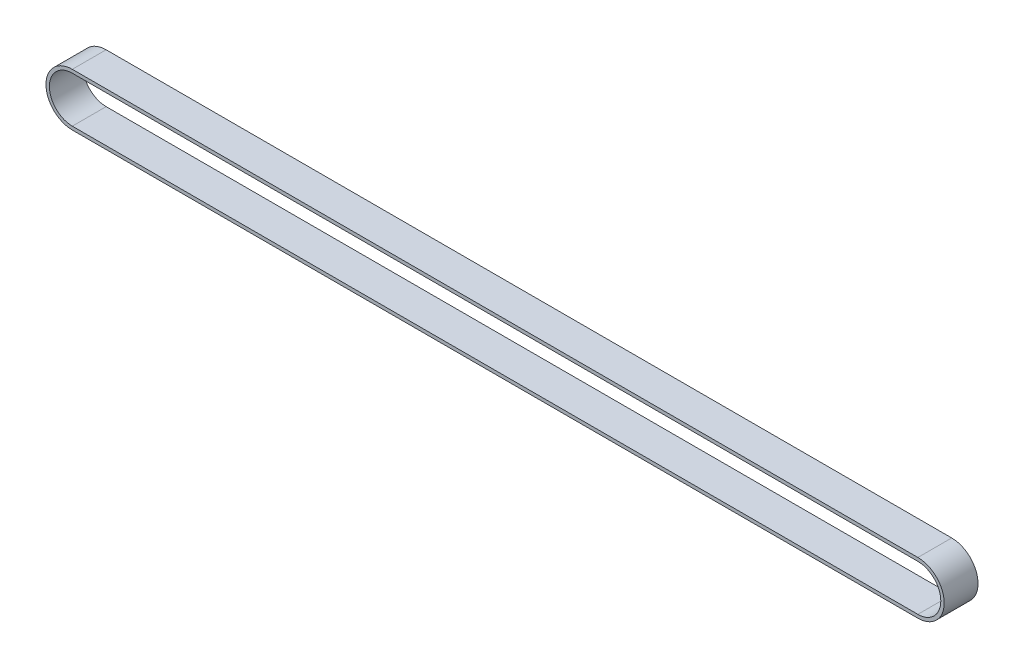
ISO-10303-21;
HEADER;
FILE_DESCRIPTION(('STEP AP214'),'2;1');
FILE_NAME('part.step','',(''),(''),'','','');
FILE_SCHEMA(('AUTOMOTIVE_DESIGN { 1 0 10303 214 1 1 1 1 }'));
ENDSEC;
DATA;
#1=APPLICATION_CONTEXT('core data for automotive mechanical design processes');
#2=APPLICATION_PROTOCOL_DEFINITION('international standard','automotive_design',2000,#1);
#3=PRODUCT_CONTEXT('',#1,'mechanical');
#4=PRODUCT('Part','Part','',(#3));
#5=PRODUCT_RELATED_PRODUCT_CATEGORY('part','',(#4));
#6=PRODUCT_DEFINITION_FORMATION('','',#4);
#7=PRODUCT_DEFINITION_CONTEXT('part definition',#1,'design');
#8=PRODUCT_DEFINITION('design','',#6,#7);
#9=PRODUCT_DEFINITION_SHAPE('','',#8);
#10=(LENGTH_UNIT() NAMED_UNIT(*) SI_UNIT(.MILLI.,.METRE.));
#11=(NAMED_UNIT(*) PLANE_ANGLE_UNIT() SI_UNIT($,.RADIAN.));
#12=(NAMED_UNIT(*) SI_UNIT($,.STERADIAN.) SOLID_ANGLE_UNIT());
#13=UNCERTAINTY_MEASURE_WITH_UNIT(LENGTH_MEASURE(1.E-05),#10,'distance_accuracy_value','');
#14=(GEOMETRIC_REPRESENTATION_CONTEXT(3) GLOBAL_UNCERTAINTY_ASSIGNED_CONTEXT((#13)) GLOBAL_UNIT_ASSIGNED_CONTEXT((#10,
#11,#12)) REPRESENTATION_CONTEXT('',''));
#15=CARTESIAN_POINT('',(0.,0.,0.));
#16=DIRECTION('',(0.,0.,1.));
#17=DIRECTION('',(1.,0.,0.));
#18=AXIS2_PLACEMENT_3D('',#15,#16,#17);
#19=CARTESIAN_POINT('',(125.,0.,5.));
#20=DIRECTION('',(0.,0.,1.));
#21=DIRECTION('',(1.,0.,0.));
#22=AXIS2_PLACEMENT_3D('',#19,#20,#21);
#23=PLANE('',#22);
#24=CARTESIAN_POINT('',(125.,0.,5.));
#25=DIRECTION('',(0.,0.,1.));
#26=DIRECTION('',(1.,0.,0.));
#27=AXIS2_PLACEMENT_3D('',#24,#25,#26);
#28=CIRCLE('',#27,7.78);
#29=CARTESIAN_POINT('',(125.,-7.78000000000003,5.));
#30=VERTEX_POINT('',#29);
#31=CARTESIAN_POINT('',(125.,7.77999999999997,5.));
#32=VERTEX_POINT('',#31);
#33=EDGE_CURVE('E134',#30,#32,#28,.T.);
#34=ORIENTED_EDGE('',*,*,#33,.T.);
#35=DIRECTION('',(-1.,0.,0.));
#36=VECTOR('',#35,1.);
#37=CARTESIAN_POINT('',(125.,7.77999999999997,5.));
#38=LINE('',#37,#36);
#39=CARTESIAN_POINT('',(-125.,7.78,5.));
#40=VERTEX_POINT('',#39);
#41=EDGE_CURVE('E137',#32,#40,#38,.T.);
#42=ORIENTED_EDGE('',*,*,#41,.T.);
#43=CARTESIAN_POINT('',(-125.,0.,5.));
#44=DIRECTION('',(0.,0.,1.));
#45=DIRECTION('',(1.,0.,0.));
#46=AXIS2_PLACEMENT_3D('',#43,#44,#45);
#47=CIRCLE('',#46,7.78);
#48=CARTESIAN_POINT('',(-125.,-7.78,5.));
#49=VERTEX_POINT('',#48);
#50=EDGE_CURVE('E140',#40,#49,#47,.T.);
#51=ORIENTED_EDGE('',*,*,#50,.T.);
#52=DIRECTION('',(1.,0.,0.));
#53=VECTOR('',#52,1.);
#54=CARTESIAN_POINT('',(125.,-7.78000000000003,5.));
#55=LINE('',#54,#53);
#56=EDGE_CURVE('E142',#49,#30,#55,.T.);
#57=ORIENTED_EDGE('',*,*,#56,.T.);
#58=EDGE_LOOP('',(#34,#42,#51,#57));
#59=FACE_BOUND('',#58,.T.);
#60=DIRECTION('',(-1.,0.,0.));
#61=VECTOR('',#60,1.);
#62=CARTESIAN_POINT('',(125.,6.78000000000003,5.));
#63=LINE('',#62,#61);
#64=CARTESIAN_POINT('',(125.,6.78000000000003,5.));
#65=VERTEX_POINT('',#64);
#66=CARTESIAN_POINT('',(-125.,6.78,5.));
#67=VERTEX_POINT('',#66);
#68=EDGE_CURVE('E106',#65,#67,#63,.T.);
#69=ORIENTED_EDGE('',*,*,#68,.F.);
#70=CARTESIAN_POINT('',(125.,0.,5.));
#71=DIRECTION('',(0.,0.,1.));
#72=DIRECTION('',(1.,0.,0.));
#73=AXIS2_PLACEMENT_3D('',#70,#71,#72);
#74=CIRCLE('',#73,6.78);
#75=CARTESIAN_POINT('',(125.,-6.77999999999997,5.));
#76=VERTEX_POINT('',#75);
#77=EDGE_CURVE('E98',#76,#65,#74,.T.);
#78=ORIENTED_EDGE('',*,*,#77,.F.);
#79=DIRECTION('',(1.,0.,0.));
#80=VECTOR('',#79,1.);
#81=CARTESIAN_POINT('',(125.,-6.77999999999997,5.));
#82=LINE('',#81,#80);
#83=CARTESIAN_POINT('',(-125.,-6.78,5.));
#84=VERTEX_POINT('',#83);
#85=EDGE_CURVE('E120',#84,#76,#82,.T.);
#86=ORIENTED_EDGE('',*,*,#85,.F.);
#87=CARTESIAN_POINT('',(-125.,0.,5.));
#88=DIRECTION('',(0.,0.,1.));
#89=DIRECTION('',(1.,0.,0.));
#90=AXIS2_PLACEMENT_3D('',#87,#88,#89);
#91=CIRCLE('',#90,6.78);
#92=EDGE_CURVE('E118',#67,#84,#91,.T.);
#93=ORIENTED_EDGE('',*,*,#92,.F.);
#94=EDGE_LOOP('',(#69,#78,#86,#93));
#95=FACE_BOUND('',#94,.T.);
#96=ADVANCED_FACE('F33',(#59,#95),#23,.T.);
#97=CARTESIAN_POINT('',(125.,0.,-5.));
#98=DIRECTION('',(0.,0.,1.));
#99=DIRECTION('',(1.,0.,0.));
#100=AXIS2_PLACEMENT_3D('',#97,#98,#99);
#101=PLANE('',#100);
#102=CARTESIAN_POINT('',(125.,0.,-5.));
#103=DIRECTION('',(0.,0.,1.));
#104=DIRECTION('',(1.,0.,0.));
#105=AXIS2_PLACEMENT_3D('',#102,#103,#104);
#106=CIRCLE('',#105,7.78);
#107=CARTESIAN_POINT('',(125.,-7.78000000000003,-5.));
#108=VERTEX_POINT('',#107);
#109=CARTESIAN_POINT('',(125.,7.77999999999997,-5.));
#110=VERTEX_POINT('',#109);
#111=EDGE_CURVE('E114',#108,#110,#106,.T.);
#112=ORIENTED_EDGE('',*,*,#111,.F.);
#113=DIRECTION('',(1.,0.,0.));
#114=VECTOR('',#113,1.);
#115=CARTESIAN_POINT('',(125.,-7.78000000000003,-5.));
#116=LINE('',#115,#114);
#117=CARTESIAN_POINT('',(-125.,-7.78,-5.));
#118=VERTEX_POINT('',#117);
#119=EDGE_CURVE('E138',#118,#108,#116,.T.);
#120=ORIENTED_EDGE('',*,*,#119,.F.);
#121=CARTESIAN_POINT('',(-125.,0.,-5.));
#122=DIRECTION('',(0.,0.,1.));
#123=DIRECTION('',(1.,0.,0.));
#124=AXIS2_PLACEMENT_3D('',#121,#122,#123);
#125=CIRCLE('',#124,7.78);
#126=CARTESIAN_POINT('',(-125.,7.78,-5.));
#127=VERTEX_POINT('',#126);
#128=EDGE_CURVE('E149',#127,#118,#125,.T.);
#129=ORIENTED_EDGE('',*,*,#128,.F.);
#130=DIRECTION('',(-1.,0.,0.));
#131=VECTOR('',#130,1.);
#132=CARTESIAN_POINT('',(125.,7.77999999999997,-5.));
#133=LINE('',#132,#131);
#134=EDGE_CURVE('E147',#110,#127,#133,.T.);
#135=ORIENTED_EDGE('',*,*,#134,.F.);
#136=EDGE_LOOP('',(#112,#120,#129,#135));
#137=FACE_BOUND('',#136,.T.);
#138=CARTESIAN_POINT('',(125.,0.,-5.));
#139=DIRECTION('',(0.,0.,1.));
#140=DIRECTION('',(1.,0.,0.));
#141=AXIS2_PLACEMENT_3D('',#138,#139,#140);
#142=CIRCLE('',#141,6.78);
#143=CARTESIAN_POINT('',(125.,-6.77999999999997,-5.));
#144=VERTEX_POINT('',#143);
#145=CARTESIAN_POINT('',(125.,6.78000000000003,-5.));
#146=VERTEX_POINT('',#145);
#147=EDGE_CURVE('E56',#144,#146,#142,.T.);
#148=ORIENTED_EDGE('',*,*,#147,.T.);
#149=DIRECTION('',(-1.,0.,0.));
#150=VECTOR('',#149,1.);
#151=CARTESIAN_POINT('',(125.,6.78000000000003,-5.));
#152=LINE('',#151,#150);
#153=CARTESIAN_POINT('',(-125.,6.78,-5.));
#154=VERTEX_POINT('',#153);
#155=EDGE_CURVE('E113',#146,#154,#152,.T.);
#156=ORIENTED_EDGE('',*,*,#155,.T.);
#157=CARTESIAN_POINT('',(-125.,0.,-5.));
#158=DIRECTION('',(0.,0.,1.));
#159=DIRECTION('',(1.,0.,0.));
#160=AXIS2_PLACEMENT_3D('',#157,#158,#159);
#161=CIRCLE('',#160,6.78);
#162=CARTESIAN_POINT('',(-125.,-6.78,-5.));
#163=VERTEX_POINT('',#162);
#164=EDGE_CURVE('E126',#154,#163,#161,.T.);
#165=ORIENTED_EDGE('',*,*,#164,.T.);
#166=DIRECTION('',(1.,0.,0.));
#167=VECTOR('',#166,1.);
#168=CARTESIAN_POINT('',(125.,-6.77999999999997,-5.));
#169=LINE('',#168,#167);
#170=EDGE_CURVE('E107',#163,#144,#169,.T.);
#171=ORIENTED_EDGE('',*,*,#170,.T.);
#172=EDGE_LOOP('',(#148,#156,#165,#171));
#173=FACE_BOUND('',#172,.T.);
#174=ADVANCED_FACE('F167',(#137,#173),#101,.F.);
#175=CARTESIAN_POINT('',(125.,0.,5.));
#176=DIRECTION('',(0.,0.,-1.));
#177=DIRECTION('',(-1.,0.,0.));
#178=AXIS2_PLACEMENT_3D('',#175,#176,#177);
#179=CYLINDRICAL_SURFACE('',#178,7.78);
#180=ORIENTED_EDGE('',*,*,#111,.T.);
#181=DIRECTION('',(0.,0.,-1.));
#182=VECTOR('',#181,1.);
#183=CARTESIAN_POINT('',(125.,7.77999999999997,5.));
#184=LINE('',#183,#182);
#185=EDGE_CURVE('E11',#32,#110,#184,.T.);
#186=ORIENTED_EDGE('',*,*,#185,.F.);
#187=ORIENTED_EDGE('',*,*,#33,.F.);
#188=DIRECTION('',(0.,0.,-1.));
#189=VECTOR('',#188,1.);
#190=CARTESIAN_POINT('',(125.,-7.78000000000003,5.));
#191=LINE('',#190,#189);
#192=EDGE_CURVE('E144',#30,#108,#191,.T.);
#193=ORIENTED_EDGE('',*,*,#192,.T.);
#194=EDGE_LOOP('',(#180,#186,#187,#193));
#195=FACE_BOUND('',#194,.T.);
#196=ADVANCED_FACE('F35',(#195),#179,.T.);
#197=CARTESIAN_POINT('',(125.,7.77999999999997,5.));
#198=DIRECTION('',(0.,-1.,0.));
#199=DIRECTION('',(1.,0.,0.));
#200=AXIS2_PLACEMENT_3D('',#197,#198,#199);
#201=PLANE('',#200);
#202=ORIENTED_EDGE('',*,*,#134,.T.);
#203=DIRECTION('',(0.,0.,-1.));
#204=VECTOR('',#203,1.);
#205=CARTESIAN_POINT('',(-125.,7.78,5.));
#206=LINE('',#205,#204);
#207=EDGE_CURVE('E41',#40,#127,#206,.T.);
#208=ORIENTED_EDGE('',*,*,#207,.F.);
#209=ORIENTED_EDGE('',*,*,#41,.F.);
#210=ORIENTED_EDGE('',*,*,#185,.T.);
#211=EDGE_LOOP('',(#202,#208,#209,#210));
#212=FACE_BOUND('',#211,.T.);
#213=ADVANCED_FACE('F177',(#212),#201,.F.);
#214=CARTESIAN_POINT('',(-125.,0.,5.));
#215=DIRECTION('',(0.,0.,-1.));
#216=DIRECTION('',(-1.,0.,0.));
#217=AXIS2_PLACEMENT_3D('',#214,#215,#216);
#218=CYLINDRICAL_SURFACE('',#217,7.78);
#219=ORIENTED_EDGE('',*,*,#128,.T.);
#220=DIRECTION('',(0.,0.,-1.));
#221=VECTOR('',#220,1.);
#222=CARTESIAN_POINT('',(-125.,-7.78,5.));
#223=LINE('',#222,#221);
#224=EDGE_CURVE('E154',#49,#118,#223,.T.);
#225=ORIENTED_EDGE('',*,*,#224,.F.);
#226=ORIENTED_EDGE('',*,*,#50,.F.);
#227=ORIENTED_EDGE('',*,*,#207,.T.);
#228=EDGE_LOOP('',(#219,#225,#226,#227));
#229=FACE_BOUND('',#228,.T.);
#230=ADVANCED_FACE('F161',(#229),#218,.T.);
#231=CARTESIAN_POINT('',(125.,-7.78000000000003,5.));
#232=DIRECTION('',(0.,1.,0.));
#233=DIRECTION('',(-1.,0.,0.));
#234=AXIS2_PLACEMENT_3D('',#231,#232,#233);
#235=PLANE('',#234);
#236=ORIENTED_EDGE('',*,*,#119,.T.);
#237=ORIENTED_EDGE('',*,*,#192,.F.);
#238=ORIENTED_EDGE('',*,*,#56,.F.);
#239=ORIENTED_EDGE('',*,*,#224,.T.);
#240=EDGE_LOOP('',(#236,#237,#238,#239));
#241=FACE_BOUND('',#240,.T.);
#242=ADVANCED_FACE('F171',(#241),#235,.F.);
#243=CARTESIAN_POINT('',(125.,0.,5.));
#244=DIRECTION('',(0.,0.,-1.));
#245=DIRECTION('',(-1.,0.,0.));
#246=AXIS2_PLACEMENT_3D('',#243,#244,#245);
#247=CYLINDRICAL_SURFACE('',#246,6.78);
#248=ORIENTED_EDGE('',*,*,#147,.F.);
#249=DIRECTION('',(0.,0.,-1.));
#250=VECTOR('',#249,1.);
#251=CARTESIAN_POINT('',(125.,-6.77999999999997,5.));
#252=LINE('',#251,#250);
#253=EDGE_CURVE('E102',#76,#144,#252,.T.);
#254=ORIENTED_EDGE('',*,*,#253,.F.);
#255=ORIENTED_EDGE('',*,*,#77,.T.);
#256=DIRECTION('',(0.,0.,-1.));
#257=VECTOR('',#256,1.);
#258=CARTESIAN_POINT('',(125.,6.78000000000003,5.));
#259=LINE('',#258,#257);
#260=EDGE_CURVE('E101',#65,#146,#259,.T.);
#261=ORIENTED_EDGE('',*,*,#260,.T.);
#262=EDGE_LOOP('',(#248,#254,#255,#261));
#263=FACE_BOUND('',#262,.T.);
#264=ADVANCED_FACE('F100',(#263),#247,.F.);
#265=CARTESIAN_POINT('',(125.,6.78000000000003,5.));
#266=DIRECTION('',(0.,-1.,0.));
#267=DIRECTION('',(1.,0.,0.));
#268=AXIS2_PLACEMENT_3D('',#265,#266,#267);
#269=PLANE('',#268);
#270=ORIENTED_EDGE('',*,*,#155,.F.);
#271=ORIENTED_EDGE('',*,*,#260,.F.);
#272=ORIENTED_EDGE('',*,*,#68,.T.);
#273=DIRECTION('',(0.,0.,-1.));
#274=VECTOR('',#273,1.);
#275=CARTESIAN_POINT('',(-125.,6.78,5.));
#276=LINE('',#275,#274);
#277=EDGE_CURVE('E115',#67,#154,#276,.T.);
#278=ORIENTED_EDGE('',*,*,#277,.T.);
#279=EDGE_LOOP('',(#270,#271,#272,#278));
#280=FACE_BOUND('',#279,.T.);
#281=ADVANCED_FACE('F110',(#280),#269,.T.);
#282=CARTESIAN_POINT('',(-125.,0.,5.));
#283=DIRECTION('',(0.,0.,-1.));
#284=DIRECTION('',(-1.,0.,0.));
#285=AXIS2_PLACEMENT_3D('',#282,#283,#284);
#286=CYLINDRICAL_SURFACE('',#285,6.78);
#287=ORIENTED_EDGE('',*,*,#164,.F.);
#288=ORIENTED_EDGE('',*,*,#277,.F.);
#289=ORIENTED_EDGE('',*,*,#92,.T.);
#290=DIRECTION('',(0.,0.,-1.));
#291=VECTOR('',#290,1.);
#292=CARTESIAN_POINT('',(-125.,-6.78,5.));
#293=LINE('',#292,#291);
#294=EDGE_CURVE('E48',#84,#163,#293,.T.);
#295=ORIENTED_EDGE('',*,*,#294,.T.);
#296=EDGE_LOOP('',(#287,#288,#289,#295));
#297=FACE_BOUND('',#296,.T.);
#298=ADVANCED_FACE('F200',(#297),#286,.F.);
#299=CARTESIAN_POINT('',(125.,-6.77999999999997,5.));
#300=DIRECTION('',(0.,1.,0.));
#301=DIRECTION('',(-1.,0.,0.));
#302=AXIS2_PLACEMENT_3D('',#299,#300,#301);
#303=PLANE('',#302);
#304=ORIENTED_EDGE('',*,*,#170,.F.);
#305=ORIENTED_EDGE('',*,*,#294,.F.);
#306=ORIENTED_EDGE('',*,*,#85,.T.);
#307=ORIENTED_EDGE('',*,*,#253,.T.);
#308=EDGE_LOOP('',(#304,#305,#306,#307));
#309=FACE_BOUND('',#308,.T.);
#310=ADVANCED_FACE('F204',(#309),#303,.T.);
#311=CLOSED_SHELL('',(#96,#174,#196,#213,#230,#242,#264,#281,#298,#310));
#312=MANIFOLD_SOLID_BREP('B2',#311);
#313=ADVANCED_BREP_SHAPE_REPRESENTATION('',(#18,#312),#14);
#314=SHAPE_DEFINITION_REPRESENTATION(#9,#313);
ENDSEC;
END-ISO-10303-21;
